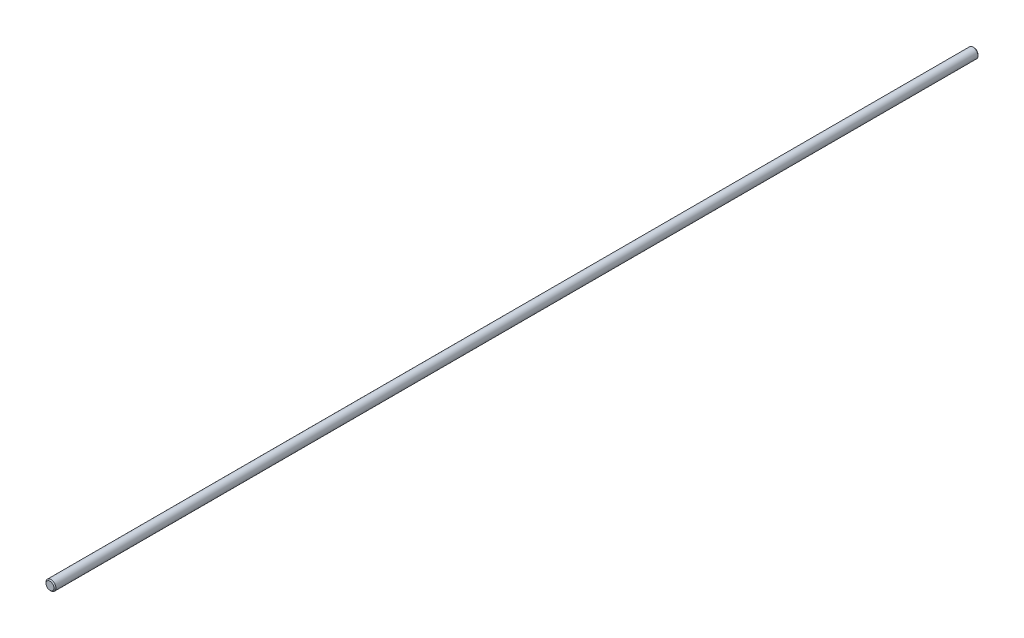
ISO-10303-21;
HEADER;
FILE_DESCRIPTION(('STEP AP214'),'2;1');
FILE_NAME('part.step','',(''),(''),'','','');
FILE_SCHEMA(('AUTOMOTIVE_DESIGN { 1 0 10303 214 1 1 1 1 }'));
ENDSEC;
DATA;
#1=APPLICATION_CONTEXT('core data for automotive mechanical design processes');
#2=APPLICATION_PROTOCOL_DEFINITION('international standard','automotive_design',2000,#1);
#3=PRODUCT_CONTEXT('',#1,'mechanical');
#4=PRODUCT('Part','Part','',(#3));
#5=PRODUCT_RELATED_PRODUCT_CATEGORY('part','',(#4));
#6=PRODUCT_DEFINITION_FORMATION('','',#4);
#7=PRODUCT_DEFINITION_CONTEXT('part definition',#1,'design');
#8=PRODUCT_DEFINITION('design','',#6,#7);
#9=PRODUCT_DEFINITION_SHAPE('','',#8);
#10=(LENGTH_UNIT() NAMED_UNIT(*) SI_UNIT(.MILLI.,.METRE.));
#11=(NAMED_UNIT(*) PLANE_ANGLE_UNIT() SI_UNIT($,.RADIAN.));
#12=(NAMED_UNIT(*) SI_UNIT($,.STERADIAN.) SOLID_ANGLE_UNIT());
#13=UNCERTAINTY_MEASURE_WITH_UNIT(LENGTH_MEASURE(1.E-05),#10,'distance_accuracy_value','');
#14=(GEOMETRIC_REPRESENTATION_CONTEXT(3) GLOBAL_UNCERTAINTY_ASSIGNED_CONTEXT((#13)) GLOBAL_UNIT_ASSIGNED_CONTEXT((#10,
#11,#12)) REPRESENTATION_CONTEXT('',''));
#15=CARTESIAN_POINT('',(0.,0.,0.));
#16=DIRECTION('',(0.,0.,1.));
#17=DIRECTION('',(1.,0.,0.));
#18=AXIS2_PLACEMENT_3D('',#15,#16,#17);
#19=CARTESIAN_POINT('',(0.,0.,464.));
#20=DIRECTION('',(0.,0.,-1.));
#21=DIRECTION('',(-1.,0.,0.));
#22=AXIS2_PLACEMENT_3D('',#19,#20,#21);
#23=CYLINDRICAL_SURFACE('',#22,2.495);
#24=CARTESIAN_POINT('',(0.,0.,463.5));
#25=DIRECTION('',(0.,0.,1.));
#26=DIRECTION('',(1.,0.,0.));
#27=AXIS2_PLACEMENT_3D('',#24,#25,#26);
#28=CIRCLE('',#27,2.495);
#29=CARTESIAN_POINT('',(-2.495,0.,463.5));
#30=VERTEX_POINT('',#29);
#31=EDGE_CURVE('E37',#30,#30,#28,.F.);
#32=CARTESIAN_POINT('',(0.,0.,0.500000000000167));
#33=DIRECTION('',(0.,0.,1.));
#34=DIRECTION('',(1.,0.,0.));
#35=AXIS2_PLACEMENT_3D('',#32,#33,#34);
#36=CIRCLE('',#35,2.495);
#37=CARTESIAN_POINT('',(-2.495,0.,0.500000000000167));
#38=VERTEX_POINT('',#37);
#39=EDGE_CURVE('E41',#38,#38,#36,.T.);
#40=CARTESIAN_POINT('',(-2.495,0.,463.5));
#41=CARTESIAN_POINT('',(-2.495,0.,458.677083333334));
#42=CARTESIAN_POINT('',(-2.495,0.,453.854166666667));
#43=CARTESIAN_POINT('',(-2.495,0.,444.208333333334));
#44=CARTESIAN_POINT('',(-2.495,0.,439.385416666667));
#45=CARTESIAN_POINT('',(-2.495,0.,429.739583333334));
#46=CARTESIAN_POINT('',(-2.495,0.,424.916666666667));
#47=CARTESIAN_POINT('',(-2.495,0.,415.270833333334));
#48=CARTESIAN_POINT('',(-2.495,0.,410.447916666667));
#49=CARTESIAN_POINT('',(-2.495,0.,400.802083333334));
#50=CARTESIAN_POINT('',(-2.495,0.,395.979166666667));
#51=CARTESIAN_POINT('',(-2.495,0.,386.333333333334));
#52=CARTESIAN_POINT('',(-2.495,0.,381.510416666667));
#53=CARTESIAN_POINT('',(-2.495,0.,371.864583333334));
#54=CARTESIAN_POINT('',(-2.495,0.,367.041666666667));
#55=CARTESIAN_POINT('',(-2.495,0.,357.395833333334));
#56=CARTESIAN_POINT('',(-2.495,0.,352.572916666667));
#57=CARTESIAN_POINT('',(-2.495,0.,342.927083333334));
#58=CARTESIAN_POINT('',(-2.495,0.,338.104166666667));
#59=CARTESIAN_POINT('',(-2.495,0.,328.458333333334));
#60=CARTESIAN_POINT('',(-2.495,0.,323.635416666667));
#61=CARTESIAN_POINT('',(-2.495,0.,313.989583333334));
#62=CARTESIAN_POINT('',(-2.495,0.,309.166666666667));
#63=CARTESIAN_POINT('',(-2.495,0.,299.520833333334));
#64=CARTESIAN_POINT('',(-2.495,0.,294.697916666667));
#65=CARTESIAN_POINT('',(-2.495,0.,285.052083333334));
#66=CARTESIAN_POINT('',(-2.495,0.,280.229166666667));
#67=CARTESIAN_POINT('',(-2.495,0.,270.583333333334));
#68=CARTESIAN_POINT('',(-2.495,0.,265.760416666667));
#69=CARTESIAN_POINT('',(-2.495,0.,256.114583333334));
#70=CARTESIAN_POINT('',(-2.495,0.,251.291666666667));
#71=CARTESIAN_POINT('',(-2.495,0.,241.645833333334));
#72=CARTESIAN_POINT('',(-2.495,0.,236.822916666667));
#73=CARTESIAN_POINT('',(-2.495,0.,227.177083333334));
#74=CARTESIAN_POINT('',(-2.495,0.,222.354166666667));
#75=CARTESIAN_POINT('',(-2.495,0.,212.708333333334));
#76=CARTESIAN_POINT('',(-2.495,0.,207.885416666667));
#77=CARTESIAN_POINT('',(-2.495,0.,198.239583333334));
#78=CARTESIAN_POINT('',(-2.495,0.,193.416666666667));
#79=CARTESIAN_POINT('',(-2.495,0.,183.770833333334));
#80=CARTESIAN_POINT('',(-2.495,0.,178.947916666667));
#81=CARTESIAN_POINT('',(-2.495,0.,169.302083333334));
#82=CARTESIAN_POINT('',(-2.495,0.,164.479166666667));
#83=CARTESIAN_POINT('',(-2.495,0.,154.833333333334));
#84=CARTESIAN_POINT('',(-2.495,0.,150.010416666667));
#85=CARTESIAN_POINT('',(-2.495,0.,140.364583333334));
#86=CARTESIAN_POINT('',(-2.495,0.,135.541666666667));
#87=CARTESIAN_POINT('',(-2.495,0.,125.895833333334));
#88=CARTESIAN_POINT('',(-2.495,0.,121.072916666667));
#89=CARTESIAN_POINT('',(-2.495,0.,111.427083333334));
#90=CARTESIAN_POINT('',(-2.495,0.,106.604166666667));
#91=CARTESIAN_POINT('',(-2.495,0.,96.9583333333335));
#92=CARTESIAN_POINT('',(-2.495,0.,92.1354166666669));
#93=CARTESIAN_POINT('',(-2.495,0.,82.4895833333335));
#94=CARTESIAN_POINT('',(-2.495,0.,77.6666666666669));
#95=CARTESIAN_POINT('',(-2.495,0.,68.0208333333335));
#96=CARTESIAN_POINT('',(-2.495,0.,63.1979166666669));
#97=CARTESIAN_POINT('',(-2.495,0.,53.5520833333335));
#98=CARTESIAN_POINT('',(-2.495,0.,48.7291666666669));
#99=CARTESIAN_POINT('',(-2.495,0.,39.0833333333335));
#100=CARTESIAN_POINT('',(-2.495,0.,34.2604166666668));
#101=CARTESIAN_POINT('',(-2.495,0.,24.6145833333335));
#102=CARTESIAN_POINT('',(-2.495,0.,19.7916666666669));
#103=CARTESIAN_POINT('',(-2.495,0.,10.1458333333335));
#104=CARTESIAN_POINT('',(-2.495,0.,5.32291666666684));
#105=CARTESIAN_POINT('',(-2.495,0.,0.500000000000167));
#106=B_SPLINE_CURVE_WITH_KNOTS('',3,(#40,#41,#42,#43,#44,#45,#46,#47,#48,#49,#50,#51,#52,#53,
#54,#55,#56,#57,#58,#59,#60,#61,#62,#63,#64,#65,#66,#67,#68,#69,#70,#71,#72,#73,#74,#75,#76,#77,
#78,#79,#80,#81,#82,#83,#84,#85,#86,#87,#88,#89,#90,#91,#92,#93,#94,#95,#96,#97,#98,#99,#100,
#101,#102,#103,#104,#105),.UNSPECIFIED.,.F.,.F.,(4,2,2,2,2,2,2,2,2,2,2,2,2,2,2,2,2,2,2,2,2,2,2,
2,2,2,2,2,2,2,2,2,4),(0.,14.46875,28.9375,43.40625,57.875,72.34375,86.8125,101.28125,115.75,
130.21875,144.6875,159.15625,173.625,188.09375,202.5625,217.03125,231.5,245.96875,260.4375,
274.90625,289.375,303.84375,318.3125,332.78125,347.25,361.71875,376.1875,390.65625,405.125,
419.59375,434.0625,448.53125,463.),.UNSPECIFIED.);
#107=EDGE_CURVE('BSEAM30',#30,#38,#106,.T.);
#108=ORIENTED_EDGE('',*,*,#31,.T.);
#109=ORIENTED_EDGE('',*,*,#39,.T.);
#110=ORIENTED_EDGE('',*,*,#107,.T.);
#111=ORIENTED_EDGE('',*,*,#107,.F.);
#112=EDGE_LOOP('',(#108,#110,#109,#111));
#113=FACE_BOUND('',#112,.T.);
#114=ADVANCED_FACE('F30',(#113),#23,.T.);
#115=CARTESIAN_POINT('',(0.,0.,464.));
#116=DIRECTION('',(0.,0.,1.));
#117=DIRECTION('',(1.,0.,0.));
#118=AXIS2_PLACEMENT_3D('',#115,#116,#117);
#119=PLANE('',#118);
#120=CARTESIAN_POINT('',(0.,0.,464.));
#121=DIRECTION('',(0.,0.,1.));
#122=DIRECTION('',(1.,0.,0.));
#123=AXIS2_PLACEMENT_3D('',#120,#121,#122);
#124=CIRCLE('',#123,1.9950000000003);
#125=CARTESIAN_POINT('',(1.9950000000003,0.,464.));
#126=VERTEX_POINT('',#125);
#127=EDGE_CURVE('E45',#126,#126,#124,.T.);
#128=ORIENTED_EDGE('',*,*,#127,.T.);
#129=EDGE_LOOP('',(#128));
#130=FACE_BOUND('',#129,.T.);
#131=ADVANCED_FACE('F51',(#130),#119,.T.);
#132=CARTESIAN_POINT('',(0.,0.,0.));
#133=DIRECTION('',(0.,0.,1.));
#134=DIRECTION('',(1.,0.,0.));
#135=AXIS2_PLACEMENT_3D('',#132,#133,#134);
#136=PLANE('',#135);
#137=CARTESIAN_POINT('',(0.,0.,0.));
#138=DIRECTION('',(0.,0.,1.));
#139=DIRECTION('',(1.,0.,0.));
#140=AXIS2_PLACEMENT_3D('',#137,#138,#139);
#141=CIRCLE('',#140,1.99499999999986);
#142=CARTESIAN_POINT('',(1.99499999999986,0.,0.));
#143=VERTEX_POINT('',#142);
#144=EDGE_CURVE('E10',#143,#143,#141,.F.);
#145=ORIENTED_EDGE('',*,*,#144,.T.);
#146=EDGE_LOOP('',(#145));
#147=FACE_BOUND('',#146,.T.);
#148=ADVANCED_FACE('F55',(#147),#136,.F.);
#149=CARTESIAN_POINT('',(0.,0.,464.));
#150=DIRECTION('',(0.,0.,-1.));
#151=DIRECTION('',(-1.,0.,0.));
#152=AXIS2_PLACEMENT_3D('',#149,#150,#151);
#153=CONICAL_SURFACE('',#152,1.9950000000003,0.78539816339748);
#154=ORIENTED_EDGE('',*,*,#31,.F.);
#155=EDGE_LOOP('',(#154));
#156=FACE_BOUND('',#155,.T.);
#157=ORIENTED_EDGE('',*,*,#127,.F.);
#158=EDGE_LOOP('',(#157));
#159=FACE_BOUND('',#158,.T.);
#160=ADVANCED_FACE('F53',(#156,#159),#153,.T.);
#161=CARTESIAN_POINT('',(0.,0.,0.500000000000167));
#162=DIRECTION('',(0.,0.,1.));
#163=DIRECTION('',(1.,0.,0.));
#164=AXIS2_PLACEMENT_3D('',#161,#162,#163);
#165=CONICAL_SURFACE('',#164,2.495,0.785398163397424);
#166=ORIENTED_EDGE('',*,*,#144,.F.);
#167=EDGE_LOOP('',(#166));
#168=FACE_BOUND('',#167,.T.);
#169=ORIENTED_EDGE('',*,*,#39,.F.);
#170=EDGE_LOOP('',(#169));
#171=FACE_BOUND('',#170,.T.);
#172=ADVANCED_FACE('F32',(#168,#171),#165,.T.);
#173=CLOSED_SHELL('',(#114,#131,#148,#160,#172));
#174=MANIFOLD_SOLID_BREP('B2',#173);
#175=ADVANCED_BREP_SHAPE_REPRESENTATION('',(#18,#174),#14);
#176=SHAPE_DEFINITION_REPRESENTATION(#9,#175);
ENDSEC;
END-ISO-10303-21;
